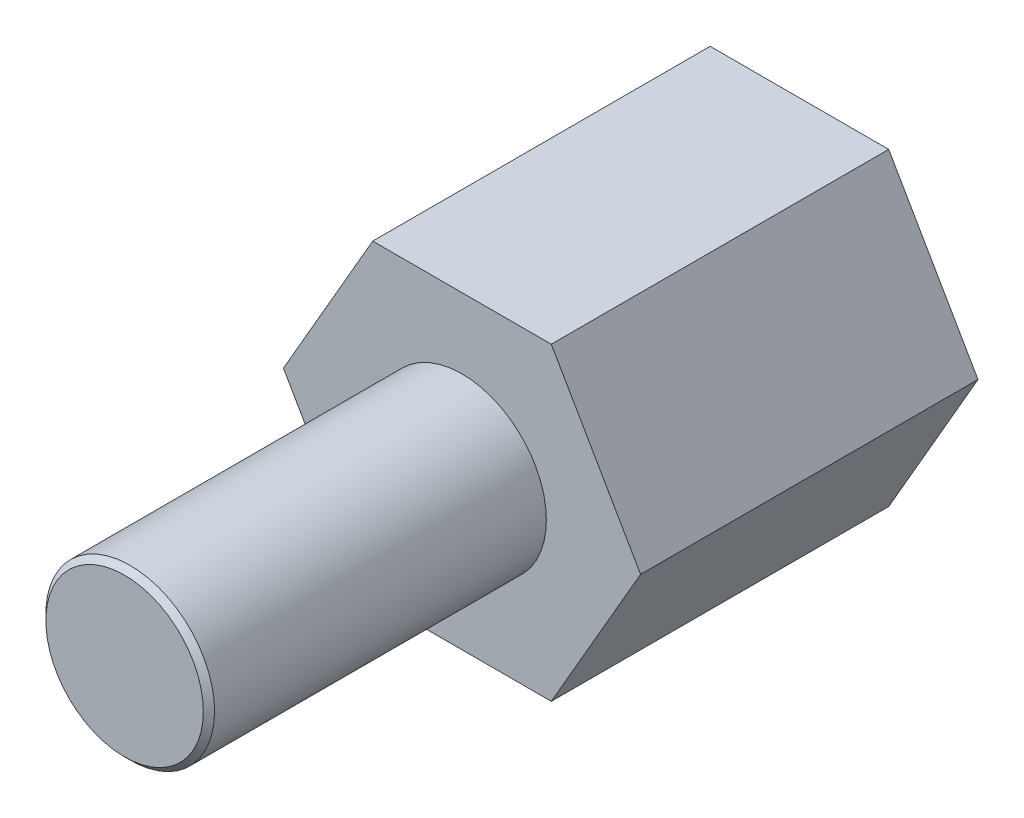
ISO-10303-21;
HEADER;
FILE_DESCRIPTION(('STEP AP214'),'2;1');
FILE_NAME('part.step','',(''),(''),'','','');
FILE_SCHEMA(('AUTOMOTIVE_DESIGN { 1 0 10303 214 1 1 1 1 }'));
ENDSEC;
DATA;
#1=APPLICATION_CONTEXT('core data for automotive mechanical design processes');
#2=APPLICATION_PROTOCOL_DEFINITION('international standard','automotive_design',2000,#1);
#3=PRODUCT_CONTEXT('',#1,'mechanical');
#4=PRODUCT('Part','Part','',(#3));
#5=PRODUCT_RELATED_PRODUCT_CATEGORY('part','',(#4));
#6=PRODUCT_DEFINITION_FORMATION('','',#4);
#7=PRODUCT_DEFINITION_CONTEXT('part definition',#1,'design');
#8=PRODUCT_DEFINITION('design','',#6,#7);
#9=PRODUCT_DEFINITION_SHAPE('','',#8);
#10=(LENGTH_UNIT() NAMED_UNIT(*) SI_UNIT(.MILLI.,.METRE.));
#11=(NAMED_UNIT(*) PLANE_ANGLE_UNIT() SI_UNIT($,.RADIAN.));
#12=(NAMED_UNIT(*) SI_UNIT($,.STERADIAN.) SOLID_ANGLE_UNIT());
#13=UNCERTAINTY_MEASURE_WITH_UNIT(LENGTH_MEASURE(1.E-05),#10,'distance_accuracy_value','');
#14=(GEOMETRIC_REPRESENTATION_CONTEXT(3) GLOBAL_UNCERTAINTY_ASSIGNED_CONTEXT((#13)) GLOBAL_UNIT_ASSIGNED_CONTEXT((#10,
#11,#12)) REPRESENTATION_CONTEXT('',''));
#15=CARTESIAN_POINT('',(0.,0.,0.));
#16=DIRECTION('',(0.,0.,1.));
#17=DIRECTION('',(1.,0.,0.));
#18=AXIS2_PLACEMENT_3D('',#15,#16,#17);
#19=CARTESIAN_POINT('',(3.17542648054294,0.,6.));
#20=DIRECTION('',(-0.866025403784438,-0.5,0.));
#21=DIRECTION('',(0.5,-0.866025403784439,0.));
#22=AXIS2_PLACEMENT_3D('',#19,#20,#21);
#23=PLANE('',#22);
#24=DIRECTION('',(-0.5,0.866025403784439,0.));
#25=VECTOR('',#24,1.);
#26=CARTESIAN_POINT('',(3.17542648054294,0.,0.));
#27=LINE('',#26,#25);
#28=CARTESIAN_POINT('',(3.17542648054294,0.,0.));
#29=VERTEX_POINT('',#28);
#30=CARTESIAN_POINT('',(1.58771324027147,2.75,0.));
#31=VERTEX_POINT('',#30);
#32=EDGE_CURVE('E123',#29,#31,#27,.T.);
#33=ORIENTED_EDGE('',*,*,#32,.T.);
#34=DIRECTION('',(0.,0.,-1.));
#35=VECTOR('',#34,1.);
#36=CARTESIAN_POINT('',(1.58771324027147,2.75,6.));
#37=LINE('',#36,#35);
#38=CARTESIAN_POINT('',(1.58771324027147,2.75,6.));
#39=VERTEX_POINT('',#38);
#40=EDGE_CURVE('E141',#39,#31,#37,.T.);
#41=ORIENTED_EDGE('',*,*,#40,.F.);
#42=DIRECTION('',(-0.5,0.866025403784439,0.));
#43=VECTOR('',#42,1.);
#44=CARTESIAN_POINT('',(3.17542648054294,0.,6.));
#45=LINE('',#44,#43);
#46=CARTESIAN_POINT('',(3.17542648054294,0.,6.));
#47=VERTEX_POINT('',#46);
#48=EDGE_CURVE('E134',#47,#39,#45,.T.);
#49=ORIENTED_EDGE('',*,*,#48,.F.);
#50=DIRECTION('',(0.,0.,-1.));
#51=VECTOR('',#50,1.);
#52=CARTESIAN_POINT('',(3.17542648054294,0.,6.));
#53=LINE('',#52,#51);
#54=EDGE_CURVE('E119',#47,#29,#53,.T.);
#55=ORIENTED_EDGE('',*,*,#54,.T.);
#56=EDGE_LOOP('',(#33,#41,#49,#55));
#57=FACE_BOUND('',#56,.T.);
#58=ADVANCED_FACE('F35',(#57),#23,.F.);
#59=CARTESIAN_POINT('',(1.58771324027147,2.75,6.));
#60=DIRECTION('',(0.,-1.,0.));
#61=DIRECTION('',(1.,0.,0.));
#62=AXIS2_PLACEMENT_3D('',#59,#60,#61);
#63=PLANE('',#62);
#64=DIRECTION('',(-1.,0.,0.));
#65=VECTOR('',#64,1.);
#66=CARTESIAN_POINT('',(1.58771324027147,2.75,0.));
#67=LINE('',#66,#65);
#68=CARTESIAN_POINT('',(-1.58771324027147,2.75,0.));
#69=VERTEX_POINT('',#68);
#70=EDGE_CURVE('E126',#31,#69,#67,.T.);
#71=ORIENTED_EDGE('',*,*,#70,.T.);
#72=DIRECTION('',(0.,0.,-1.));
#73=VECTOR('',#72,1.);
#74=CARTESIAN_POINT('',(-1.58771324027147,2.75,6.));
#75=LINE('',#74,#73);
#76=CARTESIAN_POINT('',(-1.58771324027147,2.75,6.));
#77=VERTEX_POINT('',#76);
#78=EDGE_CURVE('E138',#77,#69,#75,.T.);
#79=ORIENTED_EDGE('',*,*,#78,.F.);
#80=DIRECTION('',(-1.,0.,0.));
#81=VECTOR('',#80,1.);
#82=CARTESIAN_POINT('',(1.58771324027147,2.75,6.));
#83=LINE('',#82,#81);
#84=EDGE_CURVE('E91',#39,#77,#83,.T.);
#85=ORIENTED_EDGE('',*,*,#84,.F.);
#86=ORIENTED_EDGE('',*,*,#40,.T.);
#87=EDGE_LOOP('',(#71,#79,#85,#86));
#88=FACE_BOUND('',#87,.T.);
#89=ADVANCED_FACE('F156',(#88),#63,.F.);
#90=CARTESIAN_POINT('',(-1.58771324027147,2.75,6.));
#91=DIRECTION('',(0.866025403784439,-0.5,0.));
#92=DIRECTION('',(0.5,0.866025403784439,0.));
#93=AXIS2_PLACEMENT_3D('',#90,#91,#92);
#94=PLANE('',#93);
#95=DIRECTION('',(-0.5,-0.866025403784439,0.));
#96=VECTOR('',#95,1.);
#97=CARTESIAN_POINT('',(-1.58771324027147,2.75,0.));
#98=LINE('',#97,#96);
#99=CARTESIAN_POINT('',(-3.17542648054294,0.,0.));
#100=VERTEX_POINT('',#99);
#101=EDGE_CURVE('E129',#69,#100,#98,.T.);
#102=ORIENTED_EDGE('',*,*,#101,.T.);
#103=DIRECTION('',(0.,0.,-1.));
#104=VECTOR('',#103,1.);
#105=CARTESIAN_POINT('',(-3.17542648054294,0.,6.));
#106=LINE('',#105,#104);
#107=CARTESIAN_POINT('',(-3.17542648054294,0.,6.));
#108=VERTEX_POINT('',#107);
#109=EDGE_CURVE('E114',#108,#100,#106,.T.);
#110=ORIENTED_EDGE('',*,*,#109,.F.);
#111=DIRECTION('',(-0.5,-0.866025403784439,0.));
#112=VECTOR('',#111,1.);
#113=CARTESIAN_POINT('',(-1.58771324027147,2.75,6.));
#114=LINE('',#113,#112);
#115=EDGE_CURVE('E105',#77,#108,#114,.T.);
#116=ORIENTED_EDGE('',*,*,#115,.F.);
#117=ORIENTED_EDGE('',*,*,#78,.T.);
#118=EDGE_LOOP('',(#102,#110,#116,#117));
#119=FACE_BOUND('',#118,.T.);
#120=ADVANCED_FACE('F159',(#119),#94,.F.);
#121=CARTESIAN_POINT('',(-3.17542648054294,0.,6.));
#122=DIRECTION('',(0.866025403784438,0.5,0.));
#123=DIRECTION('',(-0.5,0.866025403784438,0.));
#124=AXIS2_PLACEMENT_3D('',#121,#122,#123);
#125=PLANE('',#124);
#126=DIRECTION('',(0.5,-0.866025403784438,0.));
#127=VECTOR('',#126,1.);
#128=CARTESIAN_POINT('',(-3.17542648054294,0.,0.));
#129=LINE('',#128,#127);
#130=CARTESIAN_POINT('',(-1.58771324027147,-2.75,0.));
#131=VERTEX_POINT('',#130);
#132=EDGE_CURVE('E113',#100,#131,#129,.T.);
#133=ORIENTED_EDGE('',*,*,#132,.T.);
#134=DIRECTION('',(0.,0.,-1.));
#135=VECTOR('',#134,1.);
#136=CARTESIAN_POINT('',(-1.58771324027147,-2.75,6.));
#137=LINE('',#136,#135);
#138=CARTESIAN_POINT('',(-1.58771324027147,-2.75,6.));
#139=VERTEX_POINT('',#138);
#140=EDGE_CURVE('E110',#139,#131,#137,.T.);
#141=ORIENTED_EDGE('',*,*,#140,.F.);
#142=DIRECTION('',(0.5,-0.866025403784438,0.));
#143=VECTOR('',#142,1.);
#144=CARTESIAN_POINT('',(-3.17542648054294,0.,6.));
#145=LINE('',#144,#143);
#146=EDGE_CURVE('E99',#108,#139,#145,.T.);
#147=ORIENTED_EDGE('',*,*,#146,.F.);
#148=ORIENTED_EDGE('',*,*,#109,.T.);
#149=EDGE_LOOP('',(#133,#141,#147,#148));
#150=FACE_BOUND('',#149,.T.);
#151=ADVANCED_FACE('F111',(#150),#125,.F.);
#152=CARTESIAN_POINT('',(-1.58771324027147,-2.75,6.));
#153=DIRECTION('',(0.,1.,0.));
#154=DIRECTION('',(-1.,0.,0.));
#155=AXIS2_PLACEMENT_3D('',#152,#153,#154);
#156=PLANE('',#155);
#157=DIRECTION('',(1.,0.,0.));
#158=VECTOR('',#157,1.);
#159=CARTESIAN_POINT('',(-1.58771324027147,-2.75,0.));
#160=LINE('',#159,#158);
#161=CARTESIAN_POINT('',(1.58771324027147,-2.75,0.));
#162=VERTEX_POINT('',#161);
#163=EDGE_CURVE('E76',#131,#162,#160,.T.);
#164=ORIENTED_EDGE('',*,*,#163,.T.);
#165=DIRECTION('',(0.,0.,-1.));
#166=VECTOR('',#165,1.);
#167=CARTESIAN_POINT('',(1.58771324027147,-2.75,6.));
#168=LINE('',#167,#166);
#169=CARTESIAN_POINT('',(1.58771324027147,-2.75,6.));
#170=VERTEX_POINT('',#169);
#171=EDGE_CURVE('E115',#170,#162,#168,.T.);
#172=ORIENTED_EDGE('',*,*,#171,.F.);
#173=DIRECTION('',(1.,0.,0.));
#174=VECTOR('',#173,1.);
#175=CARTESIAN_POINT('',(-1.58771324027147,-2.75,6.));
#176=LINE('',#175,#174);
#177=EDGE_CURVE('E103',#139,#170,#176,.T.);
#178=ORIENTED_EDGE('',*,*,#177,.F.);
#179=ORIENTED_EDGE('',*,*,#140,.T.);
#180=EDGE_LOOP('',(#164,#172,#178,#179));
#181=FACE_BOUND('',#180,.T.);
#182=ADVANCED_FACE('F117',(#181),#156,.F.);
#183=CARTESIAN_POINT('',(1.58771324027147,-2.75,6.));
#184=DIRECTION('',(-0.866025403784439,0.5,0.));
#185=DIRECTION('',(-0.5,-0.866025403784439,0.));
#186=AXIS2_PLACEMENT_3D('',#183,#184,#185);
#187=PLANE('',#186);
#188=DIRECTION('',(0.5,0.866025403784439,0.));
#189=VECTOR('',#188,1.);
#190=CARTESIAN_POINT('',(1.58771324027147,-2.75,0.));
#191=LINE('',#190,#189);
#192=EDGE_CURVE('E82',#162,#29,#191,.T.);
#193=ORIENTED_EDGE('',*,*,#192,.T.);
#194=ORIENTED_EDGE('',*,*,#54,.F.);
#195=DIRECTION('',(0.5,0.866025403784439,0.));
#196=VECTOR('',#195,1.);
#197=CARTESIAN_POINT('',(1.58771324027147,-2.75,6.));
#198=LINE('',#197,#196);
#199=EDGE_CURVE('E52',#170,#47,#198,.T.);
#200=ORIENTED_EDGE('',*,*,#199,.F.);
#201=ORIENTED_EDGE('',*,*,#171,.T.);
#202=EDGE_LOOP('',(#193,#194,#200,#201));
#203=FACE_BOUND('',#202,.T.);
#204=ADVANCED_FACE('F164',(#203),#187,.F.);
#205=CARTESIAN_POINT('',(0.,0.,6.));
#206=DIRECTION('',(0.,0.,1.));
#207=DIRECTION('',(1.,0.,0.));
#208=AXIS2_PLACEMENT_3D('',#205,#206,#207);
#209=PLANE('',#208);
#210=CARTESIAN_POINT('',(0.,0.,6.));
#211=DIRECTION('',(0.,0.,1.));
#212=DIRECTION('',(1.,0.,0.));
#213=AXIS2_PLACEMENT_3D('',#210,#211,#212);
#214=CIRCLE('',#213,1.5);
#215=CARTESIAN_POINT('',(1.5,0.,6.));
#216=VERTEX_POINT('',#215);
#217=EDGE_CURVE('E142',#216,#216,#214,.T.);
#218=ORIENTED_EDGE('',*,*,#217,.F.);
#219=EDGE_LOOP('',(#218));
#220=FACE_BOUND('',#219,.T.);
#221=ORIENTED_EDGE('',*,*,#48,.T.);
#222=ORIENTED_EDGE('',*,*,#84,.T.);
#223=ORIENTED_EDGE('',*,*,#115,.T.);
#224=ORIENTED_EDGE('',*,*,#146,.T.);
#225=ORIENTED_EDGE('',*,*,#177,.T.);
#226=ORIENTED_EDGE('',*,*,#199,.T.);
#227=EDGE_LOOP('',(#221,#222,#223,#224,#225,#226));
#228=FACE_BOUND('',#227,.T.);
#229=ADVANCED_FACE('F101',(#220,#228),#209,.T.);
#230=CARTESIAN_POINT('',(0.,0.,0.));
#231=DIRECTION('',(0.,0.,1.));
#232=DIRECTION('',(1.,0.,0.));
#233=AXIS2_PLACEMENT_3D('',#230,#231,#232);
#234=PLANE('',#233);
#235=CARTESIAN_POINT('',(0.,0.,0.));
#236=DIRECTION('',(0.,0.,-1.));
#237=DIRECTION('',(-1.,0.,0.));
#238=AXIS2_PLACEMENT_3D('',#235,#236,#237);
#239=CIRCLE('',#238,1.24999999999999);
#240=CARTESIAN_POINT('',(-1.24999999999999,0.,0.));
#241=VERTEX_POINT('',#240);
#242=EDGE_CURVE('E270',#241,#241,#239,.T.);
#243=ORIENTED_EDGE('',*,*,#242,.F.);
#244=EDGE_LOOP('',(#243));
#245=FACE_BOUND('',#244,.T.);
#246=ORIENTED_EDGE('',*,*,#32,.F.);
#247=ORIENTED_EDGE('',*,*,#192,.F.);
#248=ORIENTED_EDGE('',*,*,#163,.F.);
#249=ORIENTED_EDGE('',*,*,#132,.F.);
#250=ORIENTED_EDGE('',*,*,#101,.F.);
#251=ORIENTED_EDGE('',*,*,#70,.F.);
#252=EDGE_LOOP('',(#246,#247,#248,#249,#250,#251));
#253=FACE_BOUND('',#252,.T.);
#254=ADVANCED_FACE('F162',(#245,#253),#234,.F.);
#255=CARTESIAN_POINT('',(0.,0.,12.));
#256=DIRECTION('',(0.,0.,-1.));
#257=DIRECTION('',(-1.,0.,0.));
#258=AXIS2_PLACEMENT_3D('',#255,#256,#257);
#259=CYLINDRICAL_SURFACE('',#258,1.5);
#260=CARTESIAN_POINT('',(0.,0.,11.9));
#261=DIRECTION('',(0.,0.,1.));
#262=DIRECTION('',(1.,0.,0.));
#263=AXIS2_PLACEMENT_3D('',#260,#261,#262);
#264=CIRCLE('',#263,1.5);
#265=CARTESIAN_POINT('',(1.5,0.,11.9));
#266=VERTEX_POINT('',#265);
#267=EDGE_CURVE('E11',#266,#266,#264,.F.);
#268=ORIENTED_EDGE('',*,*,#267,.T.);
#269=EDGE_LOOP('',(#268));
#270=FACE_BOUND('',#269,.T.);
#271=ORIENTED_EDGE('',*,*,#217,.T.);
#272=EDGE_LOOP('',(#271));
#273=FACE_BOUND('',#272,.T.);
#274=ADVANCED_FACE('F211',(#270,#273),#259,.T.);
#275=CARTESIAN_POINT('',(0.,0.,12.));
#276=DIRECTION('',(0.,0.,1.));
#277=DIRECTION('',(1.,0.,0.));
#278=AXIS2_PLACEMENT_3D('',#275,#276,#277);
#279=PLANE('',#278);
#280=CARTESIAN_POINT('',(0.,0.,12.));
#281=DIRECTION('',(0.,0.,1.));
#282=DIRECTION('',(1.,0.,0.));
#283=AXIS2_PLACEMENT_3D('',#280,#281,#282);
#284=CIRCLE('',#283,1.4);
#285=CARTESIAN_POINT('',(1.4,0.,12.));
#286=VERTEX_POINT('',#285);
#287=EDGE_CURVE('E44',#286,#286,#284,.T.);
#288=ORIENTED_EDGE('',*,*,#287,.T.);
#289=EDGE_LOOP('',(#288));
#290=FACE_BOUND('',#289,.T.);
#291=ADVANCED_FACE('F224',(#290),#279,.T.);
#292=CARTESIAN_POINT('',(0.,0.,4.));
#293=DIRECTION('',(0.,0.,-1.));
#294=DIRECTION('',(-1.,0.,0.));
#295=AXIS2_PLACEMENT_3D('',#292,#293,#294);
#296=CONICAL_SURFACE('',#295,1.25,1.02974425867665);
#297=CARTESIAN_POINT('',(0.,0.,4.75107577378445));
#298=VERTEX_POINT('',#297);
#299=VERTEX_LOOP('',#298);
#300=FACE_BOUND('',#299,.T.);
#301=CARTESIAN_POINT('',(0.,0.,4.));
#302=DIRECTION('',(0.,0.,-1.));
#303=DIRECTION('',(-1.,0.,0.));
#304=AXIS2_PLACEMENT_3D('',#301,#302,#303);
#305=CIRCLE('',#304,1.25);
#306=CARTESIAN_POINT('',(-1.25,0.,4.));
#307=VERTEX_POINT('',#306);
#308=EDGE_CURVE('E127',#307,#307,#305,.T.);
#309=ORIENTED_EDGE('',*,*,#308,.T.);
#310=EDGE_LOOP('',(#309));
#311=FACE_BOUND('',#310,.T.);
#312=ADVANCED_FACE('F218',(#300,#311),#296,.F.);
#313=CARTESIAN_POINT('',(0.,0.,0.));
#314=DIRECTION('',(0.,0.,-1.));
#315=DIRECTION('',(-1.,0.,0.));
#316=AXIS2_PLACEMENT_3D('',#313,#314,#315);
#317=CYLINDRICAL_SURFACE('',#316,1.24999999999999);
#318=ORIENTED_EDGE('',*,*,#308,.F.);
#319=EDGE_LOOP('',(#318));
#320=FACE_BOUND('',#319,.T.);
#321=ORIENTED_EDGE('',*,*,#242,.T.);
#322=EDGE_LOOP('',(#321));
#323=FACE_BOUND('',#322,.T.);
#324=ADVANCED_FACE('F223',(#320,#323),#317,.F.);
#325=CARTESIAN_POINT('',(0.,0.,12.));
#326=DIRECTION('',(0.,0.,-1.));
#327=DIRECTION('',(-1.,0.,0.));
#328=AXIS2_PLACEMENT_3D('',#325,#326,#327);
#329=CONICAL_SURFACE('',#328,1.4,0.785398163397453);
#330=ORIENTED_EDGE('',*,*,#267,.F.);
#331=EDGE_LOOP('',(#330));
#332=FACE_BOUND('',#331,.T.);
#333=ORIENTED_EDGE('',*,*,#287,.F.);
#334=EDGE_LOOP('',(#333));
#335=FACE_BOUND('',#334,.T.);
#336=ADVANCED_FACE('F37',(#332,#335),#329,.T.);
#337=CLOSED_SHELL('',(#58,#89,#120,#151,#182,#204,#229,#254,#274,#291,#312,#324,#336));
#338=MANIFOLD_SOLID_BREP('B2',#337);
#339=ADVANCED_BREP_SHAPE_REPRESENTATION('',(#18,#338),#14);
#340=SHAPE_DEFINITION_REPRESENTATION(#9,#339);
ENDSEC;
END-ISO-10303-21;
